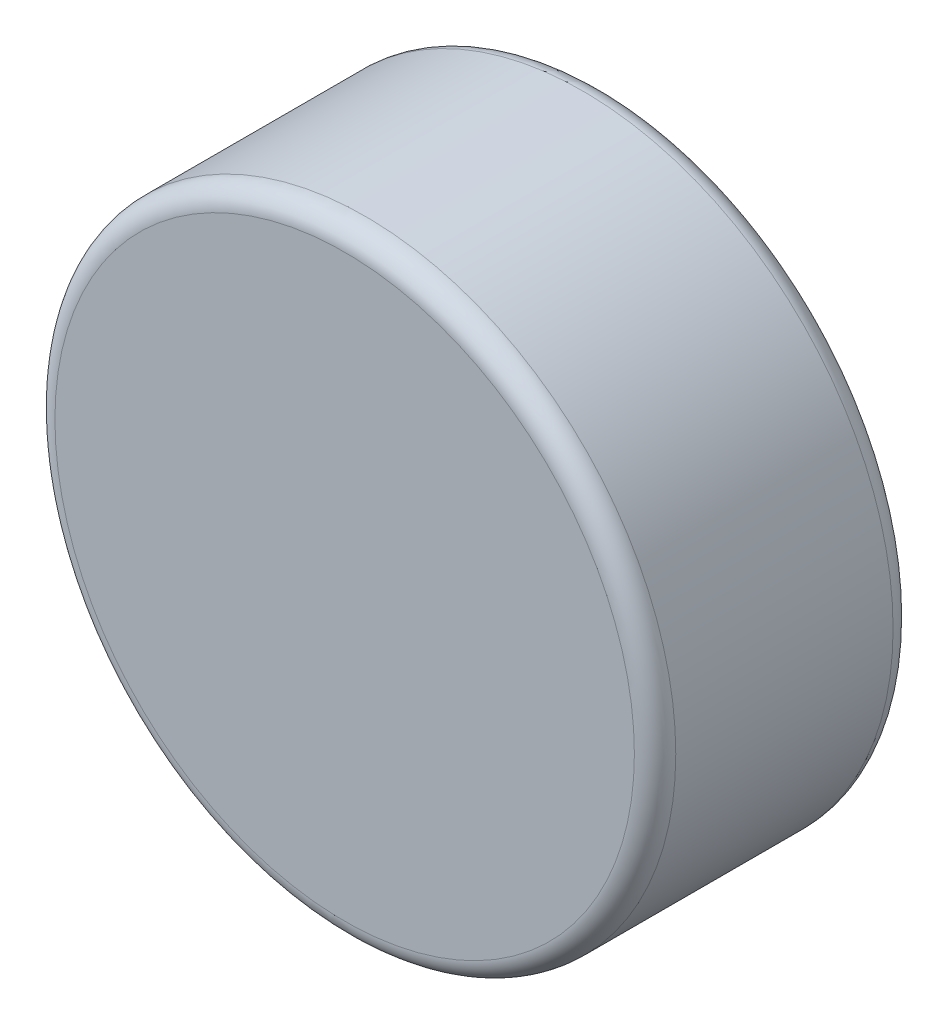
ISO-10303-21;
HEADER;
FILE_DESCRIPTION(('STEP AP214'),'2;1');
FILE_NAME('part.step','',(''),(''),'','','');
FILE_SCHEMA(('AUTOMOTIVE_DESIGN { 1 0 10303 214 1 1 1 1 }'));
ENDSEC;
DATA;
#1=APPLICATION_CONTEXT('core data for automotive mechanical design processes');
#2=APPLICATION_PROTOCOL_DEFINITION('international standard','automotive_design',2000,#1);
#3=PRODUCT_CONTEXT('',#1,'mechanical');
#4=PRODUCT('Part','Part','',(#3));
#5=PRODUCT_RELATED_PRODUCT_CATEGORY('part','',(#4));
#6=PRODUCT_DEFINITION_FORMATION('','',#4);
#7=PRODUCT_DEFINITION_CONTEXT('part definition',#1,'design');
#8=PRODUCT_DEFINITION('design','',#6,#7);
#9=PRODUCT_DEFINITION_SHAPE('','',#8);
#10=(LENGTH_UNIT() NAMED_UNIT(*) SI_UNIT(.MILLI.,.METRE.));
#11=(NAMED_UNIT(*) PLANE_ANGLE_UNIT() SI_UNIT($,.RADIAN.));
#12=(NAMED_UNIT(*) SI_UNIT($,.STERADIAN.) SOLID_ANGLE_UNIT());
#13=UNCERTAINTY_MEASURE_WITH_UNIT(LENGTH_MEASURE(1.E-05),#10,'distance_accuracy_value','');
#14=(GEOMETRIC_REPRESENTATION_CONTEXT(3) GLOBAL_UNCERTAINTY_ASSIGNED_CONTEXT((#13)) GLOBAL_UNIT_ASSIGNED_CONTEXT((#10,
#11,#12)) REPRESENTATION_CONTEXT('',''));
#15=CARTESIAN_POINT('',(0.,0.,0.));
#16=DIRECTION('',(0.,0.,1.));
#17=DIRECTION('',(1.,0.,0.));
#18=AXIS2_PLACEMENT_3D('',#15,#16,#17);
#19=CARTESIAN_POINT('',(0.,0.,2.5));
#20=DIRECTION('',(0.,0.,-1.));
#21=DIRECTION('',(-1.,0.,0.));
#22=AXIS2_PLACEMENT_3D('',#19,#20,#21);
#23=CYLINDRICAL_SURFACE('',#22,3.);
#24=CARTESIAN_POINT('',(0.,0.,0.2));
#25=DIRECTION('',(0.,0.,1.));
#26=DIRECTION('',(1.,0.,0.));
#27=AXIS2_PLACEMENT_3D('',#24,#25,#26);
#28=CIRCLE('',#27,3.);
#29=CARTESIAN_POINT('',(3.,0.,0.2));
#30=VERTEX_POINT('',#29);
#31=EDGE_CURVE('E48',#30,#30,#28,.T.);
#32=ORIENTED_EDGE('',*,*,#31,.T.);
#33=EDGE_LOOP('',(#32));
#34=FACE_BOUND('',#33,.T.);
#35=CARTESIAN_POINT('',(0.,0.,2.3));
#36=DIRECTION('',(0.,0.,1.));
#37=DIRECTION('',(1.,0.,0.));
#38=AXIS2_PLACEMENT_3D('',#35,#36,#37);
#39=CIRCLE('',#38,3.);
#40=CARTESIAN_POINT('',(3.,0.,2.3));
#41=VERTEX_POINT('',#40);
#42=EDGE_CURVE('E52',#41,#41,#39,.F.);
#43=ORIENTED_EDGE('',*,*,#42,.T.);
#44=EDGE_LOOP('',(#43));
#45=FACE_BOUND('',#44,.T.);
#46=ADVANCED_FACE('F37',(#34,#45),#23,.T.);
#47=CARTESIAN_POINT('',(0.,0.,2.5));
#48=DIRECTION('',(0.,0.,1.));
#49=DIRECTION('',(1.,0.,0.));
#50=AXIS2_PLACEMENT_3D('',#47,#48,#49);
#51=PLANE('',#50);
#52=CARTESIAN_POINT('',(0.,0.,2.5));
#53=DIRECTION('',(0.,0.,1.));
#54=DIRECTION('',(1.,0.,0.));
#55=AXIS2_PLACEMENT_3D('',#52,#53,#54);
#56=CIRCLE('',#55,2.8);
#57=CARTESIAN_POINT('',(2.8,0.,2.5));
#58=VERTEX_POINT('',#57);
#59=EDGE_CURVE('E10',#58,#58,#56,.T.);
#60=ORIENTED_EDGE('',*,*,#59,.T.);
#61=EDGE_LOOP('',(#60));
#62=FACE_BOUND('',#61,.T.);
#63=ADVANCED_FACE('F68',(#62),#51,.T.);
#64=CARTESIAN_POINT('',(0.,0.,0.));
#65=DIRECTION('',(0.,0.,1.));
#66=DIRECTION('',(1.,0.,0.));
#67=AXIS2_PLACEMENT_3D('',#64,#65,#66);
#68=PLANE('',#67);
#69=CARTESIAN_POINT('',(0.,0.,0.));
#70=DIRECTION('',(0.,0.,1.));
#71=DIRECTION('',(1.,0.,0.));
#72=AXIS2_PLACEMENT_3D('',#69,#70,#71);
#73=CIRCLE('',#72,2.8);
#74=CARTESIAN_POINT('',(2.8,0.,0.));
#75=VERTEX_POINT('',#74);
#76=EDGE_CURVE('E44',#75,#75,#73,.F.);
#77=ORIENTED_EDGE('',*,*,#76,.T.);
#78=EDGE_LOOP('',(#77));
#79=FACE_BOUND('',#78,.T.);
#80=ADVANCED_FACE('F65',(#79),#68,.F.);
#81=CARTESIAN_POINT('',(0.,0.,0.2));
#82=DIRECTION('',(0.,0.,1.));
#83=DIRECTION('',(1.,0.,0.));
#84=AXIS2_PLACEMENT_3D('',#81,#82,#83);
#85=TOROIDAL_SURFACE('',#84,2.8,0.2);
#86=ORIENTED_EDGE('',*,*,#76,.F.);
#87=EDGE_LOOP('',(#86));
#88=FACE_BOUND('',#87,.T.);
#89=ORIENTED_EDGE('',*,*,#31,.F.);
#90=EDGE_LOOP('',(#89));
#91=FACE_BOUND('',#90,.T.);
#92=ADVANCED_FACE('F61',(#88,#91),#85,.T.);
#93=CARTESIAN_POINT('',(0.,0.,2.3));
#94=DIRECTION('',(0.,0.,1.));
#95=DIRECTION('',(1.,0.,0.));
#96=AXIS2_PLACEMENT_3D('',#93,#94,#95);
#97=TOROIDAL_SURFACE('',#96,2.8,0.2);
#98=ORIENTED_EDGE('',*,*,#42,.F.);
#99=EDGE_LOOP('',(#98));
#100=FACE_BOUND('',#99,.T.);
#101=ORIENTED_EDGE('',*,*,#59,.F.);
#102=EDGE_LOOP('',(#101));
#103=FACE_BOUND('',#102,.T.);
#104=ADVANCED_FACE('F39',(#100,#103),#97,.T.);
#105=CLOSED_SHELL('',(#46,#63,#80,#92,#104));
#106=MANIFOLD_SOLID_BREP('B2',#105);
#107=ADVANCED_BREP_SHAPE_REPRESENTATION('',(#18,#106),#14);
#108=SHAPE_DEFINITION_REPRESENTATION(#9,#107);
ENDSEC;
END-ISO-10303-21;
